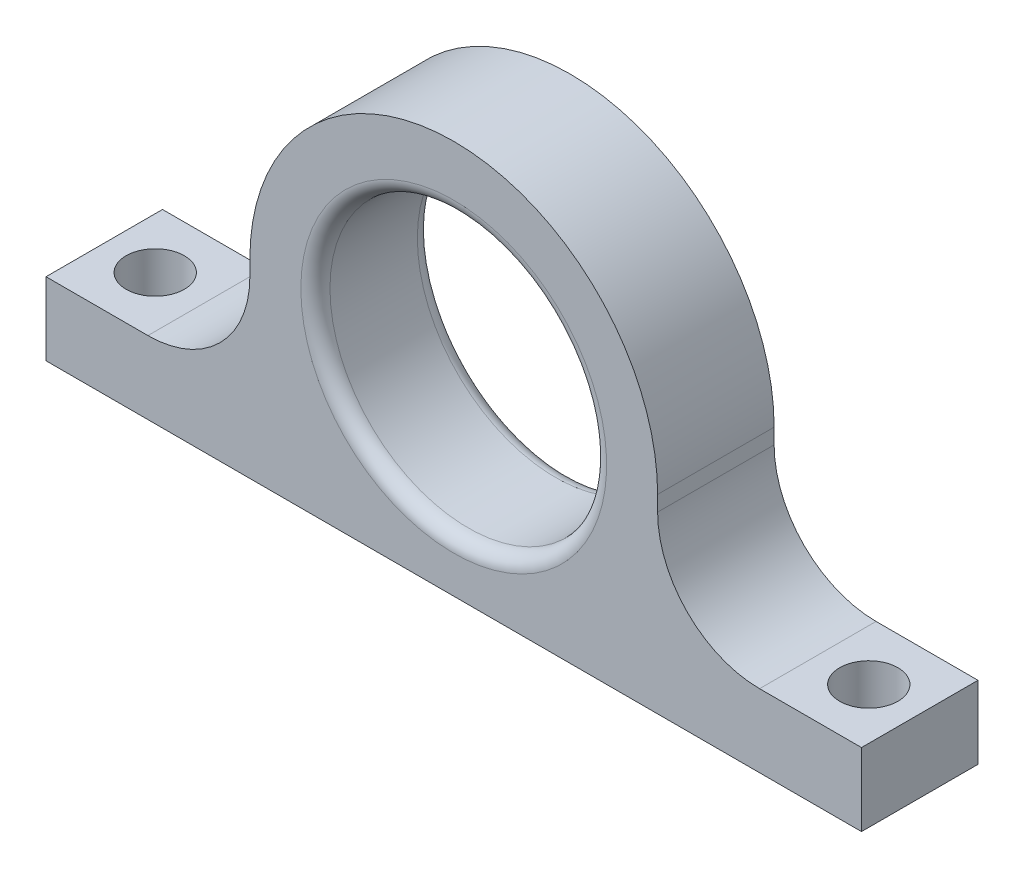
ISO-10303-21;
HEADER;
FILE_DESCRIPTION(('STEP AP214'),'2;1');
FILE_NAME('part.step','',(''),(''),'','','');
FILE_SCHEMA(('AUTOMOTIVE_DESIGN { 1 0 10303 214 1 1 1 1 }'));
ENDSEC;
DATA;
#1=APPLICATION_CONTEXT('core data for automotive mechanical design processes');
#2=APPLICATION_PROTOCOL_DEFINITION('international standard','automotive_design',2000,#1);
#3=PRODUCT_CONTEXT('',#1,'mechanical');
#4=PRODUCT('Part','Part','',(#3));
#5=PRODUCT_RELATED_PRODUCT_CATEGORY('part','',(#4));
#6=PRODUCT_DEFINITION_FORMATION('','',#4);
#7=PRODUCT_DEFINITION_CONTEXT('part definition',#1,'design');
#8=PRODUCT_DEFINITION('design','',#6,#7);
#9=PRODUCT_DEFINITION_SHAPE('','',#8);
#10=(LENGTH_UNIT() NAMED_UNIT(*) SI_UNIT(.MILLI.,.METRE.));
#11=(NAMED_UNIT(*) PLANE_ANGLE_UNIT() SI_UNIT($,.RADIAN.));
#12=(NAMED_UNIT(*) SI_UNIT($,.STERADIAN.) SOLID_ANGLE_UNIT());
#13=UNCERTAINTY_MEASURE_WITH_UNIT(LENGTH_MEASURE(1.E-05),#10,'distance_accuracy_value','');
#14=(GEOMETRIC_REPRESENTATION_CONTEXT(3) GLOBAL_UNCERTAINTY_ASSIGNED_CONTEXT((#13)) GLOBAL_UNIT_ASSIGNED_CONTEXT((#10,
#11,#12)) REPRESENTATION_CONTEXT('',''));
#15=CARTESIAN_POINT('',(0.,0.,0.));
#16=DIRECTION('',(0.,0.,1.));
#17=DIRECTION('',(1.,0.,0.));
#18=AXIS2_PLACEMENT_3D('',#15,#16,#17);
#19=CARTESIAN_POINT('',(0.,0.,8.));
#20=DIRECTION('',(0.,0.,-1.));
#21=DIRECTION('',(-1.,0.,0.));
#22=AXIS2_PLACEMENT_3D('',#19,#20,#21);
#23=PLANE('',#22);
#24=CARTESIAN_POINT('',(0.,0.,8.));
#25=DIRECTION('',(0.,0.,-1.));
#26=DIRECTION('',(-1.,0.,0.));
#27=AXIS2_PLACEMENT_3D('',#24,#25,#26);
#28=CIRCLE('',#27,10.5);
#29=CARTESIAN_POINT('',(-10.5,0.,8.));
#30=VERTEX_POINT('',#29);
#31=EDGE_CURVE('E145',#30,#30,#28,.T.);
#32=ORIENTED_EDGE('',*,*,#31,.T.);
#33=EDGE_LOOP('',(#32));
#34=FACE_BOUND('',#33,.T.);
#35=DIRECTION('',(0.,1.,0.));
#36=VECTOR('',#35,1.);
#37=CARTESIAN_POINT('',(28.,-8.0537463385401,8.));
#38=LINE('',#37,#36);
#39=CARTESIAN_POINT('',(28.,-13.0537463385401,8.));
#40=VERTEX_POINT('',#39);
#41=CARTESIAN_POINT('',(28.,-8.0537463385401,8.));
#42=VERTEX_POINT('',#41);
#43=EDGE_CURVE('E128',#40,#42,#38,.T.);
#44=ORIENTED_EDGE('',*,*,#43,.T.);
#45=DIRECTION('',(-1.,0.,0.));
#46=VECTOR('',#45,1.);
#47=CARTESIAN_POINT('',(14.,-8.0537463385401,8.));
#48=LINE('',#47,#46);
#49=CARTESIAN_POINT('',(21.,-8.0537463385401,8.));
#50=VERTEX_POINT('',#49);
#51=EDGE_CURVE('E116',#42,#50,#48,.T.);
#52=ORIENTED_EDGE('',*,*,#51,.T.);
#53=CARTESIAN_POINT('',(21.,-1.0537463385401,8.));
#54=DIRECTION('',(0.,0.,-1.));
#55=DIRECTION('',(-1.,0.,0.));
#56=AXIS2_PLACEMENT_3D('',#53,#54,#55);
#57=CIRCLE('',#56,7.);
#58=CARTESIAN_POINT('',(14.,-1.0537463385401,8.));
#59=VERTEX_POINT('',#58);
#60=EDGE_CURVE('E170',#50,#59,#57,.T.);
#61=ORIENTED_EDGE('',*,*,#60,.T.);
#62=DIRECTION('',(0.,1.,0.));
#63=VECTOR('',#62,1.);
#64=CARTESIAN_POINT('',(14.,-8.0537463385401,8.));
#65=LINE('',#64,#63);
#66=CARTESIAN_POINT('',(14.,0.,8.));
#67=VERTEX_POINT('',#66);
#68=EDGE_CURVE('E127',#59,#67,#65,.T.);
#69=ORIENTED_EDGE('',*,*,#68,.T.);
#70=CARTESIAN_POINT('',(0.,0.,8.));
#71=DIRECTION('',(0.,0.,1.));
#72=DIRECTION('',(-1.,0.,0.));
#73=AXIS2_PLACEMENT_3D('',#70,#71,#72);
#74=CIRCLE('',#73,14.);
#75=CARTESIAN_POINT('',(-14.,0.,8.));
#76=VERTEX_POINT('',#75);
#77=EDGE_CURVE('E187',#67,#76,#74,.T.);
#78=ORIENTED_EDGE('',*,*,#77,.T.);
#79=DIRECTION('',(0.,-1.,0.));
#80=VECTOR('',#79,1.);
#81=CARTESIAN_POINT('',(-14.,-8.0537463385401,8.));
#82=LINE('',#81,#80);
#83=CARTESIAN_POINT('',(-14.,-1.0537463385401,8.));
#84=VERTEX_POINT('',#83);
#85=EDGE_CURVE('E189',#76,#84,#82,.T.);
#86=ORIENTED_EDGE('',*,*,#85,.T.);
#87=CARTESIAN_POINT('',(-21.,-1.0537463385401,8.));
#88=DIRECTION('',(0.,0.,-1.));
#89=DIRECTION('',(-1.,0.,0.));
#90=AXIS2_PLACEMENT_3D('',#87,#88,#89);
#91=CIRCLE('',#90,7.);
#92=CARTESIAN_POINT('',(-21.,-8.0537463385401,8.));
#93=VERTEX_POINT('',#92);
#94=EDGE_CURVE('E11',#84,#93,#91,.T.);
#95=ORIENTED_EDGE('',*,*,#94,.T.);
#96=DIRECTION('',(-1.,0.,0.));
#97=VECTOR('',#96,1.);
#98=CARTESIAN_POINT('',(-14.,-8.0537463385401,8.));
#99=LINE('',#98,#97);
#100=CARTESIAN_POINT('',(-28.,-8.0537463385401,8.));
#101=VERTEX_POINT('',#100);
#102=EDGE_CURVE('E191',#93,#101,#99,.T.);
#103=ORIENTED_EDGE('',*,*,#102,.T.);
#104=DIRECTION('',(0.,-1.,0.));
#105=VECTOR('',#104,1.);
#106=CARTESIAN_POINT('',(-28.,-8.0537463385401,8.));
#107=LINE('',#106,#105);
#108=CARTESIAN_POINT('',(-28.,-13.0537463385401,8.));
#109=VERTEX_POINT('',#108);
#110=EDGE_CURVE('E193',#101,#109,#107,.T.);
#111=ORIENTED_EDGE('',*,*,#110,.T.);
#112=DIRECTION('',(1.,0.,0.));
#113=VECTOR('',#112,1.);
#114=CARTESIAN_POINT('',(28.,-13.0537463385401,8.));
#115=LINE('',#114,#113);
#116=EDGE_CURVE('E132',#109,#40,#115,.T.);
#117=ORIENTED_EDGE('',*,*,#116,.T.);
#118=EDGE_LOOP('',(#44,#52,#61,#69,#78,#86,#95,#103,#111,#117));
#119=FACE_BOUND('',#118,.T.);
#120=ADVANCED_FACE('F37',(#34,#119),#23,.F.);
#121=CARTESIAN_POINT('',(0.,0.,0.));
#122=DIRECTION('',(0.,0.,-1.));
#123=DIRECTION('',(-1.,0.,0.));
#124=AXIS2_PLACEMENT_3D('',#121,#122,#123);
#125=PLANE('',#124);
#126=CARTESIAN_POINT('',(0.,0.,0.));
#127=DIRECTION('',(0.,0.,-1.));
#128=DIRECTION('',(-1.,0.,0.));
#129=AXIS2_PLACEMENT_3D('',#126,#127,#128);
#130=CIRCLE('',#129,10.5);
#131=CARTESIAN_POINT('',(-10.5,0.,0.));
#132=VERTEX_POINT('',#131);
#133=EDGE_CURVE('E154',#132,#132,#130,.F.);
#134=ORIENTED_EDGE('',*,*,#133,.T.);
#135=EDGE_LOOP('',(#134));
#136=FACE_BOUND('',#135,.T.);
#137=DIRECTION('',(0.,1.,0.));
#138=VECTOR('',#137,1.);
#139=CARTESIAN_POINT('',(28.,-8.0537463385401,0.));
#140=LINE('',#139,#138);
#141=CARTESIAN_POINT('',(28.,-13.0537463385401,0.));
#142=VERTEX_POINT('',#141);
#143=CARTESIAN_POINT('',(28.,-8.0537463385401,0.));
#144=VERTEX_POINT('',#143);
#145=EDGE_CURVE('E140',#142,#144,#140,.T.);
#146=ORIENTED_EDGE('',*,*,#145,.F.);
#147=DIRECTION('',(1.,0.,0.));
#148=VECTOR('',#147,1.);
#149=CARTESIAN_POINT('',(28.,-13.0537463385401,0.));
#150=LINE('',#149,#148);
#151=CARTESIAN_POINT('',(-28.,-13.0537463385401,0.));
#152=VERTEX_POINT('',#151);
#153=EDGE_CURVE('E136',#152,#142,#150,.T.);
#154=ORIENTED_EDGE('',*,*,#153,.F.);
#155=DIRECTION('',(0.,-1.,0.));
#156=VECTOR('',#155,1.);
#157=CARTESIAN_POINT('',(-28.,-8.0537463385401,0.));
#158=LINE('',#157,#156);
#159=CARTESIAN_POINT('',(-28.,-8.0537463385401,0.));
#160=VERTEX_POINT('',#159);
#161=EDGE_CURVE('E208',#160,#152,#158,.T.);
#162=ORIENTED_EDGE('',*,*,#161,.F.);
#163=DIRECTION('',(-1.,0.,0.));
#164=VECTOR('',#163,1.);
#165=CARTESIAN_POINT('',(-14.,-8.0537463385401,0.));
#166=LINE('',#165,#164);
#167=CARTESIAN_POINT('',(-21.,-8.0537463385401,0.));
#168=VERTEX_POINT('',#167);
#169=EDGE_CURVE('E206',#168,#160,#166,.T.);
#170=ORIENTED_EDGE('',*,*,#169,.F.);
#171=CARTESIAN_POINT('',(-21.,-1.0537463385401,0.));
#172=DIRECTION('',(0.,0.,-1.));
#173=DIRECTION('',(-1.,0.,0.));
#174=AXIS2_PLACEMENT_3D('',#171,#172,#173);
#175=CIRCLE('',#174,7.);
#176=CARTESIAN_POINT('',(-14.,-1.0537463385401,0.));
#177=VERTEX_POINT('',#176);
#178=EDGE_CURVE('E46',#168,#177,#175,.F.);
#179=ORIENTED_EDGE('',*,*,#178,.T.);
#180=DIRECTION('',(0.,-1.,0.));
#181=VECTOR('',#180,1.);
#182=CARTESIAN_POINT('',(-14.,-8.0537463385401,0.));
#183=LINE('',#182,#181);
#184=CARTESIAN_POINT('',(-14.,0.,0.));
#185=VERTEX_POINT('',#184);
#186=EDGE_CURVE('E204',#185,#177,#183,.T.);
#187=ORIENTED_EDGE('',*,*,#186,.F.);
#188=CARTESIAN_POINT('',(0.,0.,0.));
#189=DIRECTION('',(0.,0.,1.));
#190=DIRECTION('',(-1.,0.,0.));
#191=AXIS2_PLACEMENT_3D('',#188,#189,#190);
#192=CIRCLE('',#191,14.);
#193=CARTESIAN_POINT('',(14.,0.,0.));
#194=VERTEX_POINT('',#193);
#195=EDGE_CURVE('E202',#194,#185,#192,.T.);
#196=ORIENTED_EDGE('',*,*,#195,.F.);
#197=DIRECTION('',(0.,1.,0.));
#198=VECTOR('',#197,1.);
#199=CARTESIAN_POINT('',(14.,-8.0537463385401,0.));
#200=LINE('',#199,#198);
#201=CARTESIAN_POINT('',(14.,-1.0537463385401,0.));
#202=VERTEX_POINT('',#201);
#203=EDGE_CURVE('E200',#202,#194,#200,.T.);
#204=ORIENTED_EDGE('',*,*,#203,.F.);
#205=CARTESIAN_POINT('',(21.,-1.0537463385401,0.));
#206=DIRECTION('',(0.,0.,-1.));
#207=DIRECTION('',(-1.,0.,0.));
#208=AXIS2_PLACEMENT_3D('',#205,#206,#207);
#209=CIRCLE('',#208,7.);
#210=CARTESIAN_POINT('',(21.,-8.0537463385401,0.));
#211=VERTEX_POINT('',#210);
#212=EDGE_CURVE('E168',#202,#211,#209,.F.);
#213=ORIENTED_EDGE('',*,*,#212,.T.);
#214=DIRECTION('',(-1.,0.,0.));
#215=VECTOR('',#214,1.);
#216=CARTESIAN_POINT('',(14.,-8.0537463385401,0.));
#217=LINE('',#216,#215);
#218=EDGE_CURVE('E198',#144,#211,#217,.T.);
#219=ORIENTED_EDGE('',*,*,#218,.F.);
#220=EDGE_LOOP('',(#146,#154,#162,#170,#179,#187,#196,#204,#213,#219));
#221=FACE_BOUND('',#220,.T.);
#222=ADVANCED_FACE('F223',(#136,#221),#125,.T.);
#223=CARTESIAN_POINT('',(28.,-8.0537463385401,8.));
#224=DIRECTION('',(-1.,0.,0.));
#225=DIRECTION('',(0.,-1.,0.));
#226=AXIS2_PLACEMENT_3D('',#223,#224,#225);
#227=PLANE('',#226);
#228=ORIENTED_EDGE('',*,*,#145,.T.);
#229=DIRECTION('',(0.,0.,-1.));
#230=VECTOR('',#229,1.);
#231=CARTESIAN_POINT('',(28.,-8.0537463385401,8.));
#232=LINE('',#231,#230);
#233=EDGE_CURVE('E121',#42,#144,#232,.T.);
#234=ORIENTED_EDGE('',*,*,#233,.F.);
#235=ORIENTED_EDGE('',*,*,#43,.F.);
#236=DIRECTION('',(0.,0.,-1.));
#237=VECTOR('',#236,1.);
#238=CARTESIAN_POINT('',(28.,-13.0537463385401,8.));
#239=LINE('',#238,#237);
#240=EDGE_CURVE('E196',#40,#142,#239,.T.);
#241=ORIENTED_EDGE('',*,*,#240,.T.);
#242=EDGE_LOOP('',(#228,#234,#235,#241));
#243=FACE_BOUND('',#242,.T.);
#244=ADVANCED_FACE('F138',(#243),#227,.F.);
#245=CARTESIAN_POINT('',(14.,-8.0537463385401,8.));
#246=DIRECTION('',(0.,-1.,0.));
#247=DIRECTION('',(0.,0.,-1.));
#248=AXIS2_PLACEMENT_3D('',#245,#246,#247);
#249=PLANE('',#248);
#250=CARTESIAN_POINT('',(24.5,-8.0537463385401,4.));
#251=DIRECTION('',(0.,1.,0.));
#252=DIRECTION('',(0.,0.,1.));
#253=AXIS2_PLACEMENT_3D('',#250,#251,#252);
#254=CIRCLE('',#253,2.);
#255=CARTESIAN_POINT('',(24.5,-8.0537463385401,6.));
#256=VERTEX_POINT('',#255);
#257=EDGE_CURVE('E174',#256,#256,#254,.T.);
#258=ORIENTED_EDGE('',*,*,#257,.F.);
#259=EDGE_LOOP('',(#258));
#260=FACE_BOUND('',#259,.T.);
#261=ORIENTED_EDGE('',*,*,#218,.T.);
#262=DIRECTION('',(0.,0.,-1.));
#263=VECTOR('',#262,1.);
#264=CARTESIAN_POINT('',(21.,-8.0537463385401,8.));
#265=LINE('',#264,#263);
#266=EDGE_CURVE('E124',#211,#50,#265,.F.);
#267=ORIENTED_EDGE('',*,*,#266,.T.);
#268=ORIENTED_EDGE('',*,*,#51,.F.);
#269=ORIENTED_EDGE('',*,*,#233,.T.);
#270=EDGE_LOOP('',(#261,#267,#268,#269));
#271=FACE_BOUND('',#270,.T.);
#272=ADVANCED_FACE('F119',(#260,#271),#249,.F.);
#273=CARTESIAN_POINT('',(14.,-8.0537463385401,8.));
#274=DIRECTION('',(-1.,0.,0.));
#275=DIRECTION('',(0.,0.,1.));
#276=AXIS2_PLACEMENT_3D('',#273,#274,#275);
#277=PLANE('',#276);
#278=ORIENTED_EDGE('',*,*,#68,.F.);
#279=DIRECTION('',(0.,0.,-1.));
#280=VECTOR('',#279,1.);
#281=CARTESIAN_POINT('',(14.,-1.0537463385401,0.));
#282=LINE('',#281,#280);
#283=EDGE_CURVE('E160',#59,#202,#282,.T.);
#284=ORIENTED_EDGE('',*,*,#283,.T.);
#285=ORIENTED_EDGE('',*,*,#203,.T.);
#286=DIRECTION('',(0.,0.,-1.));
#287=VECTOR('',#286,1.);
#288=CARTESIAN_POINT('',(14.,0.,8.));
#289=LINE('',#288,#287);
#290=EDGE_CURVE('E142',#67,#194,#289,.T.);
#291=ORIENTED_EDGE('',*,*,#290,.F.);
#292=EDGE_LOOP('',(#278,#284,#285,#291));
#293=FACE_BOUND('',#292,.T.);
#294=ADVANCED_FACE('F229',(#293),#277,.F.);
#295=CARTESIAN_POINT('',(0.,0.,8.));
#296=DIRECTION('',(0.,0.,-1.));
#297=DIRECTION('',(-1.,0.,0.));
#298=AXIS2_PLACEMENT_3D('',#295,#296,#297);
#299=CYLINDRICAL_SURFACE('',#298,14.);
#300=ORIENTED_EDGE('',*,*,#195,.T.);
#301=DIRECTION('',(0.,0.,-1.));
#302=VECTOR('',#301,1.);
#303=CARTESIAN_POINT('',(-14.,0.,8.));
#304=LINE('',#303,#302);
#305=EDGE_CURVE('E148',#76,#185,#304,.T.);
#306=ORIENTED_EDGE('',*,*,#305,.F.);
#307=ORIENTED_EDGE('',*,*,#77,.F.);
#308=ORIENTED_EDGE('',*,*,#290,.T.);
#309=EDGE_LOOP('',(#300,#306,#307,#308));
#310=FACE_BOUND('',#309,.T.);
#311=ADVANCED_FACE('F225',(#310),#299,.T.);
#312=CARTESIAN_POINT('',(-14.,-8.0537463385401,8.));
#313=DIRECTION('',(1.,0.,0.));
#314=DIRECTION('',(0.,0.,-1.));
#315=AXIS2_PLACEMENT_3D('',#312,#313,#314);
#316=PLANE('',#315);
#317=ORIENTED_EDGE('',*,*,#186,.T.);
#318=DIRECTION('',(0.,0.,-1.));
#319=VECTOR('',#318,1.);
#320=CARTESIAN_POINT('',(-14.,-1.0537463385401,8.));
#321=LINE('',#320,#319);
#322=EDGE_CURVE('E54',#177,#84,#321,.F.);
#323=ORIENTED_EDGE('',*,*,#322,.T.);
#324=ORIENTED_EDGE('',*,*,#85,.F.);
#325=ORIENTED_EDGE('',*,*,#305,.T.);
#326=EDGE_LOOP('',(#317,#323,#324,#325));
#327=FACE_BOUND('',#326,.T.);
#328=ADVANCED_FACE('F219',(#327),#316,.F.);
#329=CARTESIAN_POINT('',(-14.,-8.0537463385401,8.));
#330=DIRECTION('',(0.,-1.,0.));
#331=DIRECTION('',(0.,0.,-1.));
#332=AXIS2_PLACEMENT_3D('',#329,#330,#331);
#333=PLANE('',#332);
#334=CARTESIAN_POINT('',(-24.5,-8.0537463385401,4.));
#335=DIRECTION('',(0.,1.,0.));
#336=DIRECTION('',(0.,0.,-1.));
#337=AXIS2_PLACEMENT_3D('',#334,#335,#336);
#338=CIRCLE('',#337,2.);
#339=CARTESIAN_POINT('',(-24.5,-8.0537463385401,2.));
#340=VERTEX_POINT('',#339);
#341=EDGE_CURVE('E179',#340,#340,#338,.T.);
#342=ORIENTED_EDGE('',*,*,#341,.F.);
#343=EDGE_LOOP('',(#342));
#344=FACE_BOUND('',#343,.T.);
#345=ORIENTED_EDGE('',*,*,#102,.F.);
#346=DIRECTION('',(0.,0.,-1.));
#347=VECTOR('',#346,1.);
#348=CARTESIAN_POINT('',(-21.,-8.0537463385401,0.));
#349=LINE('',#348,#347);
#350=EDGE_CURVE('E164',#93,#168,#349,.T.);
#351=ORIENTED_EDGE('',*,*,#350,.T.);
#352=ORIENTED_EDGE('',*,*,#169,.T.);
#353=DIRECTION('',(0.,0.,-1.));
#354=VECTOR('',#353,1.);
#355=CARTESIAN_POINT('',(-28.,-8.0537463385401,8.));
#356=LINE('',#355,#354);
#357=EDGE_CURVE('E215',#101,#160,#356,.T.);
#358=ORIENTED_EDGE('',*,*,#357,.F.);
#359=EDGE_LOOP('',(#345,#351,#352,#358));
#360=FACE_BOUND('',#359,.T.);
#361=ADVANCED_FACE('F244',(#344,#360),#333,.F.);
#362=CARTESIAN_POINT('',(-28.,-8.0537463385401,8.));
#363=DIRECTION('',(1.,0.,0.));
#364=DIRECTION('',(0.,1.,0.));
#365=AXIS2_PLACEMENT_3D('',#362,#363,#364);
#366=PLANE('',#365);
#367=ORIENTED_EDGE('',*,*,#161,.T.);
#368=DIRECTION('',(0.,0.,-1.));
#369=VECTOR('',#368,1.);
#370=CARTESIAN_POINT('',(-28.,-13.0537463385401,8.));
#371=LINE('',#370,#369);
#372=EDGE_CURVE('E212',#109,#152,#371,.T.);
#373=ORIENTED_EDGE('',*,*,#372,.F.);
#374=ORIENTED_EDGE('',*,*,#110,.F.);
#375=ORIENTED_EDGE('',*,*,#357,.T.);
#376=EDGE_LOOP('',(#367,#373,#374,#375));
#377=FACE_BOUND('',#376,.T.);
#378=ADVANCED_FACE('F240',(#377),#366,.F.);
#379=CARTESIAN_POINT('',(28.,-13.0537463385401,8.));
#380=DIRECTION('',(0.,1.,0.));
#381=DIRECTION('',(0.,0.,1.));
#382=AXIS2_PLACEMENT_3D('',#379,#380,#381);
#383=PLANE('',#382);
#384=CARTESIAN_POINT('',(24.5,-13.0537463385401,4.));
#385=DIRECTION('',(0.,1.,0.));
#386=DIRECTION('',(0.,0.,1.));
#387=AXIS2_PLACEMENT_3D('',#384,#385,#386);
#388=CIRCLE('',#387,2.);
#389=CARTESIAN_POINT('',(24.5,-13.0537463385401,6.));
#390=VERTEX_POINT('',#389);
#391=EDGE_CURVE('E41',#390,#390,#388,.T.);
#392=ORIENTED_EDGE('',*,*,#391,.T.);
#393=EDGE_LOOP('',(#392));
#394=FACE_BOUND('',#393,.T.);
#395=CARTESIAN_POINT('',(-24.5,-13.0537463385401,4.));
#396=DIRECTION('',(0.,1.,0.));
#397=DIRECTION('',(0.,0.,1.));
#398=AXIS2_PLACEMENT_3D('',#395,#396,#397);
#399=CIRCLE('',#398,2.);
#400=CARTESIAN_POINT('',(-24.5,-13.0537463385401,6.));
#401=VERTEX_POINT('',#400);
#402=EDGE_CURVE('E172',#401,#401,#399,.T.);
#403=ORIENTED_EDGE('',*,*,#402,.T.);
#404=EDGE_LOOP('',(#403));
#405=FACE_BOUND('',#404,.T.);
#406=ORIENTED_EDGE('',*,*,#153,.T.);
#407=ORIENTED_EDGE('',*,*,#240,.F.);
#408=ORIENTED_EDGE('',*,*,#116,.F.);
#409=ORIENTED_EDGE('',*,*,#372,.T.);
#410=EDGE_LOOP('',(#406,#407,#408,#409));
#411=FACE_BOUND('',#410,.T.);
#412=ADVANCED_FACE('F236',(#394,#405,#411),#383,.F.);
#413=CARTESIAN_POINT('',(0.,0.,8.));
#414=DIRECTION('',(0.,0.,-1.));
#415=DIRECTION('',(-1.,0.,0.));
#416=AXIS2_PLACEMENT_3D('',#413,#414,#415);
#417=CYLINDRICAL_SURFACE('',#416,9.5);
#418=CARTESIAN_POINT('',(0.,0.,1.));
#419=DIRECTION('',(0.,0.,-1.));
#420=DIRECTION('',(-1.,0.,0.));
#421=AXIS2_PLACEMENT_3D('',#418,#419,#420);
#422=CIRCLE('',#421,9.5);
#423=CARTESIAN_POINT('',(-9.5,0.,1.));
#424=VERTEX_POINT('',#423);
#425=EDGE_CURVE('E157',#424,#424,#422,.T.);
#426=ORIENTED_EDGE('',*,*,#425,.T.);
#427=EDGE_LOOP('',(#426));
#428=FACE_BOUND('',#427,.T.);
#429=CARTESIAN_POINT('',(0.,0.,7.));
#430=DIRECTION('',(0.,0.,-1.));
#431=DIRECTION('',(-1.,0.,0.));
#432=AXIS2_PLACEMENT_3D('',#429,#430,#431);
#433=CIRCLE('',#432,9.5);
#434=CARTESIAN_POINT('',(-9.5,0.,7.));
#435=VERTEX_POINT('',#434);
#436=EDGE_CURVE('E141',#435,#435,#433,.F.);
#437=ORIENTED_EDGE('',*,*,#436,.T.);
#438=EDGE_LOOP('',(#437));
#439=FACE_BOUND('',#438,.T.);
#440=ADVANCED_FACE('F267',(#428,#439),#417,.F.);
#441=CARTESIAN_POINT('',(0.,0.,7.));
#442=DIRECTION('',(0.,0.,-1.));
#443=DIRECTION('',(-1.,0.,0.));
#444=AXIS2_PLACEMENT_3D('',#441,#442,#443);
#445=TOROIDAL_SURFACE('',#444,10.5,1.);
#446=ORIENTED_EDGE('',*,*,#31,.F.);
#447=EDGE_LOOP('',(#446));
#448=FACE_BOUND('',#447,.T.);
#449=ORIENTED_EDGE('',*,*,#436,.F.);
#450=EDGE_LOOP('',(#449));
#451=FACE_BOUND('',#450,.T.);
#452=ADVANCED_FACE('F288',(#448,#451),#445,.T.);
#453=CARTESIAN_POINT('',(0.,0.,1.));
#454=DIRECTION('',(0.,0.,-1.));
#455=DIRECTION('',(-1.,0.,0.));
#456=AXIS2_PLACEMENT_3D('',#453,#454,#455);
#457=TOROIDAL_SURFACE('',#456,10.5,1.);
#458=ORIENTED_EDGE('',*,*,#425,.F.);
#459=EDGE_LOOP('',(#458));
#460=FACE_BOUND('',#459,.T.);
#461=ORIENTED_EDGE('',*,*,#133,.F.);
#462=EDGE_LOOP('',(#461));
#463=FACE_BOUND('',#462,.T.);
#464=ADVANCED_FACE('F257',(#460,#463),#457,.T.);
#465=CARTESIAN_POINT('',(21.,-1.0537463385401,8.));
#466=DIRECTION('',(0.,0.,1.));
#467=DIRECTION('',(1.,0.,0.));
#468=AXIS2_PLACEMENT_3D('',#465,#466,#467);
#469=CYLINDRICAL_SURFACE('',#468,7.);
#470=ORIENTED_EDGE('',*,*,#60,.F.);
#471=ORIENTED_EDGE('',*,*,#266,.F.);
#472=ORIENTED_EDGE('',*,*,#212,.F.);
#473=ORIENTED_EDGE('',*,*,#283,.F.);
#474=EDGE_LOOP('',(#470,#471,#472,#473));
#475=FACE_BOUND('',#474,.T.);
#476=ADVANCED_FACE('F232',(#475),#469,.F.);
#477=CARTESIAN_POINT('',(-21.,-1.0537463385401,8.));
#478=DIRECTION('',(0.,0.,1.));
#479=DIRECTION('',(1.,0.,0.));
#480=AXIS2_PLACEMENT_3D('',#477,#478,#479);
#481=CYLINDRICAL_SURFACE('',#480,7.);
#482=ORIENTED_EDGE('',*,*,#94,.F.);
#483=ORIENTED_EDGE('',*,*,#322,.F.);
#484=ORIENTED_EDGE('',*,*,#178,.F.);
#485=ORIENTED_EDGE('',*,*,#350,.F.);
#486=EDGE_LOOP('',(#482,#483,#484,#485));
#487=FACE_BOUND('',#486,.T.);
#488=ADVANCED_FACE('F39',(#487),#481,.F.);
#489=CARTESIAN_POINT('',(-24.5,-14.0537463385401,4.));
#490=DIRECTION('',(0.,1.,0.));
#491=DIRECTION('',(0.,0.,1.));
#492=AXIS2_PLACEMENT_3D('',#489,#490,#491);
#493=CYLINDRICAL_SURFACE('',#492,2.);
#494=ORIENTED_EDGE('',*,*,#341,.T.);
#495=EDGE_LOOP('',(#494));
#496=FACE_BOUND('',#495,.T.);
#497=ORIENTED_EDGE('',*,*,#402,.F.);
#498=EDGE_LOOP('',(#497));
#499=FACE_BOUND('',#498,.T.);
#500=ADVANCED_FACE('F249',(#496,#499),#493,.F.);
#501=CARTESIAN_POINT('',(24.5,-14.0537463385401,4.));
#502=DIRECTION('',(0.,1.,0.));
#503=DIRECTION('',(0.,0.,1.));
#504=AXIS2_PLACEMENT_3D('',#501,#502,#503);
#505=CYLINDRICAL_SURFACE('',#504,2.);
#506=ORIENTED_EDGE('',*,*,#257,.T.);
#507=EDGE_LOOP('',(#506));
#508=FACE_BOUND('',#507,.T.);
#509=ORIENTED_EDGE('',*,*,#391,.F.);
#510=EDGE_LOOP('',(#509));
#511=FACE_BOUND('',#510,.T.);
#512=ADVANCED_FACE('F254',(#508,#511),#505,.F.);
#513=CLOSED_SHELL('',(#120,#222,#244,#272,#294,#311,#328,#361,#378,#412,#440,#452,#464,#476,
#488,#500,#512));
#514=MANIFOLD_SOLID_BREP('B2',#513);
#515=ADVANCED_BREP_SHAPE_REPRESENTATION('',(#18,#514),#14);
#516=SHAPE_DEFINITION_REPRESENTATION(#9,#515);
ENDSEC;
END-ISO-10303-21;
